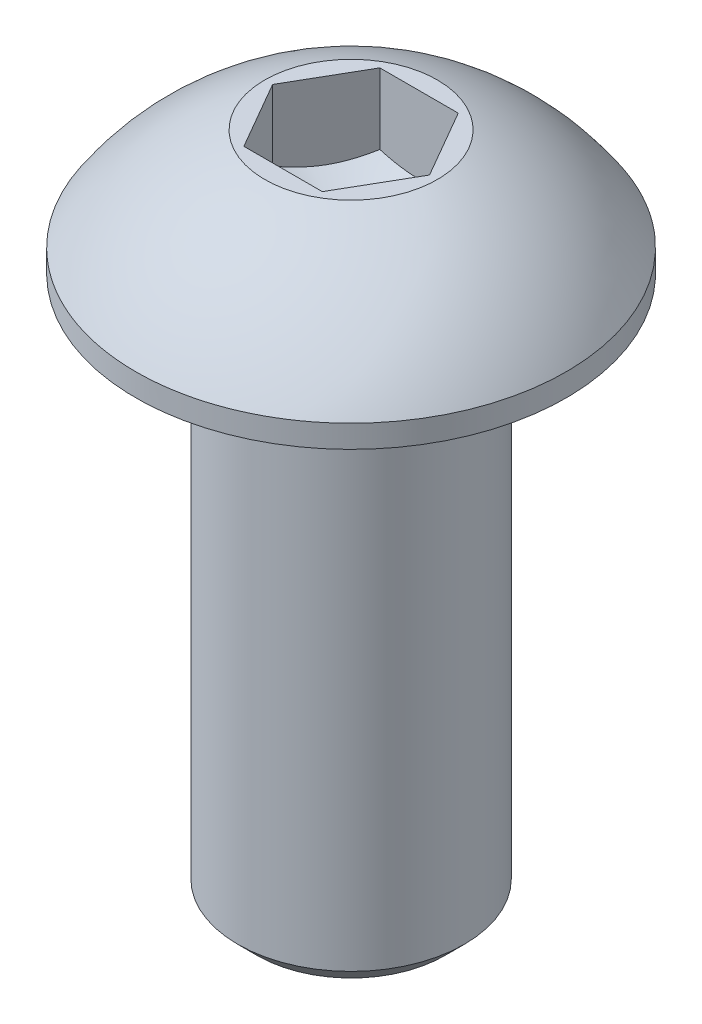
ISO-10303-21;
HEADER;
FILE_DESCRIPTION(('STEP AP214'),'2;1');
FILE_NAME('part.step','',(''),(''),'','','');
FILE_SCHEMA(('AUTOMOTIVE_DESIGN { 1 0 10303 214 1 1 1 1 }'));
ENDSEC;
DATA;
#1=APPLICATION_CONTEXT('core data for automotive mechanical design processes');
#2=APPLICATION_PROTOCOL_DEFINITION('international standard','automotive_design',2000,#1);
#3=PRODUCT_CONTEXT('',#1,'mechanical');
#4=PRODUCT('Part','Part','',(#3));
#5=PRODUCT_RELATED_PRODUCT_CATEGORY('part','',(#4));
#6=PRODUCT_DEFINITION_FORMATION('','',#4);
#7=PRODUCT_DEFINITION_CONTEXT('part definition',#1,'design');
#8=PRODUCT_DEFINITION('design','',#6,#7);
#9=PRODUCT_DEFINITION_SHAPE('','',#8);
#10=(LENGTH_UNIT() NAMED_UNIT(*) SI_UNIT(.MILLI.,.METRE.));
#11=(NAMED_UNIT(*) PLANE_ANGLE_UNIT() SI_UNIT($,.RADIAN.));
#12=(NAMED_UNIT(*) SI_UNIT($,.STERADIAN.) SOLID_ANGLE_UNIT());
#13=UNCERTAINTY_MEASURE_WITH_UNIT(LENGTH_MEASURE(1.E-05),#10,'distance_accuracy_value','');
#14=(GEOMETRIC_REPRESENTATION_CONTEXT(3) GLOBAL_UNCERTAINTY_ASSIGNED_CONTEXT((#13)) GLOBAL_UNIT_ASSIGNED_CONTEXT((#10,
#11,#12)) REPRESENTATION_CONTEXT('',''));
#15=CARTESIAN_POINT('',(0.,0.,0.));
#16=DIRECTION('',(0.,0.,1.));
#17=DIRECTION('',(1.,0.,0.));
#18=AXIS2_PLACEMENT_3D('',#15,#16,#17);
#19=CARTESIAN_POINT('',(25.2875699581005,61.0625140259606,-18.4338280446872));
#20=DIRECTION('',(-0.866156744758905,0.,0.499772441725888));
#21=DIRECTION('',(0.499772441725888,0.,0.866156744758905));
#22=AXIS2_PLACEMENT_3D('',#19,#20,#21);
#23=PLANE('',#22);
#24=CARTESIAN_POINT('',(24.4079989055874,62.1904554538318,-19.9582153160852));
#25=CARTESIAN_POINT('',(24.4460292876593,62.1684624393874,-19.8923043275488));
#26=CARTESIAN_POINT('',(24.4843880318555,62.1484570513897,-19.8258245179037));
#27=CARTESIAN_POINT('',(24.5617704570964,62.1135294060621,-19.6917127277197));
#28=CARTESIAN_POINT('',(24.6007955177377,62.0986195140854,-19.6240783567605));
#29=CARTESIAN_POINT('',(24.67836228217,62.0753989685825,-19.4896472578103));
#30=CARTESIAN_POINT('',(24.7168920261015,62.0669340457353,-19.4228712590299));
#31=CARTESIAN_POINT('',(24.7941338107735,62.0568098745484,-19.2890033387142));
#32=CARTESIAN_POINT('',(24.832845568946,62.0551422667816,-19.221911906878));
#33=CARTESIAN_POINT('',(24.905176901676,62.0585212235206,-19.0965543133322));
#34=CARTESIAN_POINT('',(24.9388071951602,62.0627268894843,-19.0382695751857));
#35=CARTESIAN_POINT('',(25.005849245782,62.0760806101283,-18.9220788456595));
#36=CARTESIAN_POINT('',(25.0392607714229,62.0852332430356,-18.8641732554882));
#37=CARTESIAN_POINT('',(25.1064420674421,62.1081249634696,-18.7477412001548));
#38=CARTESIAN_POINT('',(25.1402033386075,62.1219613063973,-18.6892294649925));
#39=CARTESIAN_POINT('',(25.2072223946131,62.1533709961848,-18.5730785879527));
#40=CARTESIAN_POINT('',(25.240481037805,62.1709369529404,-18.5154379584641));
#41=CARTESIAN_POINT('',(25.2735009599612,62.190000726653,-18.4582110570603));
#42=B_SPLINE_CURVE_WITH_KNOTS('',3,(#24,#25,#26,#27,#28,#29,#30,#31,#32,#33,#34,#35,#36,#37,#38,
#39,#40,#41),.UNSPECIFIED.,.F.,.F.,(4,2,2,2,2,2,2,2,4),(0.,0.237724267372568,0.476021395837421,
0.70841776698037,0.940528247635078,1.14260334855099,1.34486578318952,1.55161587420285,
1.75796005758239),.UNSPECIFIED.);
#43=CARTESIAN_POINT('',(24.4080009590961,62.1904554104541,-19.9582132383015));
#44=VERTEX_POINT('',#43);
#45=CARTESIAN_POINT('',(25.2735003112266,62.1900003521055,-18.4582121813837));
#46=VERTEX_POINT('',#45);
#47=EDGE_CURVE('E21',#44,#46,#42,.T.);
#48=ORIENTED_EDGE('',*,*,#47,.T.);
#49=DIRECTION('',(0.,1.,0.));
#50=VECTOR('',#49,1.);
#51=CARTESIAN_POINT('',(25.273499701385,61.0625140259606,-18.4582132383015));
#52=LINE('',#51,#50);
#53=CARTESIAN_POINT('',(25.273499701385,63.7500000000003,-18.4582132383015));
#54=VERTEX_POINT('',#53);
#55=EDGE_CURVE('E117',#54,#46,#52,.F.);
#56=ORIENTED_EDGE('',*,*,#55,.F.);
#57=DIRECTION('',(0.499772441725888,0.,0.866156744758905));
#58=VECTOR('',#57,1.);
#59=CARTESIAN_POINT('',(25.2875699581005,63.7500000000003,-18.4338280446872));
#60=LINE('',#59,#58);
#61=CARTESIAN_POINT('',(24.4080002252739,63.7500000000003,-19.9582132383015));
#62=VERTEX_POINT('',#61);
#63=EDGE_CURVE('E90',#54,#62,#60,.F.);
#64=ORIENTED_EDGE('',*,*,#63,.T.);
#65=DIRECTION('',(0.,1.,0.));
#66=VECTOR('',#65,1.);
#67=CARTESIAN_POINT('',(24.407999701385,61.0625140259606,-19.9582132383015));
#68=LINE('',#67,#66);
#69=EDGE_CURVE('E82',#62,#44,#68,.F.);
#70=ORIENTED_EDGE('',*,*,#69,.T.);
#71=EDGE_LOOP('',(#48,#56,#64,#70));
#72=FACE_BOUND('',#71,.T.);
#73=ADVANCED_FACE('F17',(#72),#23,.T.);
#74=CARTESIAN_POINT('',(24.3939294446696,61.0625140259606,-16.9338280446872));
#75=DIRECTION('',(-0.866156744758905,0.,-0.499772441725888));
#76=DIRECTION('',(-0.499772441725888,0.,0.866156744758905));
#77=AXIS2_PLACEMENT_3D('',#74,#75,#76);
#78=PLANE('',#77);
#79=CARTESIAN_POINT('',(25.2735015095974,62.1900006982656,-18.4582157730405));
#80=CARTESIAN_POINT('',(25.235483544399,62.1680447159464,-18.3923271358156));
#81=CARTESIAN_POINT('',(25.1971375066611,62.1480787424786,-18.3258696889119));
#82=CARTESIAN_POINT('',(25.1197819129971,62.1132330548837,-18.1918046507205));
#83=CARTESIAN_POINT('',(25.0807709854409,62.0983656634289,-18.1241946817774));
#84=CARTESIAN_POINT('',(25.0032329644461,62.0752296986218,-17.9898133326686));
#85=CARTESIAN_POINT('',(24.9647177875064,62.0668069329505,-17.9230626036842));
#86=CARTESIAN_POINT('',(24.8875068721702,62.0567640464519,-17.7892482003083));
#87=CARTESIAN_POINT('',(24.8488114132894,62.0551355919272,-17.7221850103631));
#88=CARTESIAN_POINT('',(24.7764807244684,62.0585827085958,-17.5968285287383));
#89=CARTESIAN_POINT('',(24.7428346512771,62.0628231270521,-17.5385164441194));
#90=CARTESIAN_POINT('',(24.6757623104552,62.0762481138399,-17.4222732195933));
#91=CARTESIAN_POINT('',(24.642336275836,62.0854372676777,-17.3643424835181));
#92=CARTESIAN_POINT('',(24.5751262561784,62.1084023640229,-17.2478606468864));
#93=CARTESIAN_POINT('',(24.5413507970164,62.122275599591,-17.1893243225501));
#94=CARTESIAN_POINT('',(24.4743041750231,62.1537572046101,-17.0731256709843));
#95=CARTESIAN_POINT('',(24.4410321505321,62.1713581694054,-17.0154618504103));
#96=CARTESIAN_POINT('',(24.4079989462962,62.1904554840955,-16.9582119296553));
#97=B_SPLINE_CURVE_WITH_KNOTS('',3,(#79,#80,#81,#82,#83,#84,#85,#86,#87,#88,#89,#90,#91,#92,#93,
#94,#95,#96),.UNSPECIFIED.,.F.,.F.,(4,2,2,2,2,2,2,2,4),(0.,0.23761959764792,0.475809511947106,
0.70810508806331,0.940115653507474,1.14229164082546,1.34465528788003,1.55151117229618,
1.75795995446192),.UNSPECIFIED.);
#98=CARTESIAN_POINT('',(24.4079988997876,62.1904555109839,-16.9582118490512));
#99=VERTEX_POINT('',#98);
#100=EDGE_CURVE('E96',#46,#99,#97,.T.);
#101=ORIENTED_EDGE('',*,*,#100,.T.);
#102=DIRECTION('',(0.,1.,0.));
#103=VECTOR('',#102,1.);
#104=CARTESIAN_POINT('',(24.4079988263394,61.0625140259606,-16.958211721758));
#105=LINE('',#104,#103);
#106=CARTESIAN_POINT('',(24.4079992638622,63.7500000000003,-16.9582124800297));
#107=VERTEX_POINT('',#106);
#108=EDGE_CURVE('E114',#99,#107,#105,.T.);
#109=ORIENTED_EDGE('',*,*,#108,.T.);
#110=DIRECTION('',(-0.499772441725888,0.,0.866156744758905));
#111=VECTOR('',#110,1.);
#112=CARTESIAN_POINT('',(24.3939294446696,63.7500000000003,-16.9338280446872));
#113=LINE('',#112,#111);
#114=EDGE_CURVE('E91',#107,#54,#113,.F.);
#115=ORIENTED_EDGE('',*,*,#114,.T.);
#116=ORIENTED_EDGE('',*,*,#55,.T.);
#117=EDGE_LOOP('',(#101,#109,#115,#116));
#118=FACE_BOUND('',#117,.T.);
#119=ADVANCED_FACE('F207',(#118),#78,.T.);
#120=CARTESIAN_POINT('',(21.7974294446695,61.0625140259606,-18.4825984319158));
#121=DIRECTION('',(0.866156744758905,0.,-0.499772441725888));
#122=DIRECTION('',(-0.499772441725888,0.,-0.866156744758905));
#123=AXIS2_PLACEMENT_3D('',#120,#121,#122);
#124=PLANE('',#123);
#125=CARTESIAN_POINT('',(22.677000235253,62.1904553032168,-16.9582116248233));
#126=CARTESIAN_POINT('',(22.6389698548026,62.1684622992195,-17.0241226039139));
#127=CARTESIAN_POINT('',(22.6006111137923,62.1484569236713,-17.0906024053152));
#128=CARTESIAN_POINT('',(22.5232286967178,62.1135293053849,-17.22471417935));
#129=CARTESIAN_POINT('',(22.4842036410632,62.0986194279848,-17.2923485424013));
#130=CARTESIAN_POINT('',(22.4066368863105,62.0753989112017,-17.4267796250984));
#131=CARTESIAN_POINT('',(22.3681071470646,62.0669340025458,-17.4935556155689));
#132=CARTESIAN_POINT('',(22.2908653724247,62.0568098588601,-17.6274235183605));
#133=CARTESIAN_POINT('',(22.2521536195975,62.055142264414,-17.6945149409843));
#134=CARTESIAN_POINT('',(22.1798223021718,62.0585212436484,-17.8198725080382));
#135=CARTESIAN_POINT('',(22.1461920185744,62.0627269183172,-17.8781572290391));
#136=CARTESIAN_POINT('',(22.0791499879139,62.0760806526748,-17.9943479239621));
#137=CARTESIAN_POINT('',(22.0457384723475,62.0852332905823,-18.0522534966761));
#138=CARTESIAN_POINT('',(21.9785571969066,62.1081250174652,-18.1686855163476));
#139=CARTESIAN_POINT('',(21.9447959362393,62.1219613617224,-18.2271972333151));
#140=CARTESIAN_POINT('',(21.8777769009423,62.153371051093,-18.3433480744635));
#141=CARTESIAN_POINT('',(21.8445182679619,62.1709370061128,-18.400988686254));
#142=CARTESIAN_POINT('',(21.8114983558446,62.1900007768814,-18.4582155702605));
#143=B_SPLINE_CURVE_WITH_KNOTS('',3,(#125,#126,#127,#128,#129,#130,#131,#132,#133,#134,#135,
#136,#137,#138,#139,#140,#141,#142),.UNSPECIFIED.,.F.,.F.,(4,2,2,2,2,2,2,2,4),(0.,
0.237724232525688,0.476021325137557,0.708417663198815,0.940528111144143,1.14260315465067,
1.34486553162718,1.55161556186056,1.75795968482533),.UNSPECIFIED.);
#144=CARTESIAN_POINT('',(22.6770001022706,62.1904552793362,-16.9582125435256));
#145=VERTEX_POINT('',#144);
#146=CARTESIAN_POINT('',(21.8114983193965,62.1900007979248,-18.4582156334287));
#147=VERTEX_POINT('',#146);
#148=EDGE_CURVE('E87',#145,#147,#143,.T.);
#149=ORIENTED_EDGE('',*,*,#148,.T.);
#150=DIRECTION('',(0.,1.,0.));
#151=VECTOR('',#150,1.);
#152=CARTESIAN_POINT('',(21.8114982728377,61.0625140259606,-18.4582157141199));
#153=LINE('',#152,#151);
#154=CARTESIAN_POINT('',(21.8114989871114,63.7500000000003,-18.4582144762107));
#155=VERTEX_POINT('',#154);
#156=EDGE_CURVE('E97',#147,#155,#153,.T.);
#157=ORIENTED_EDGE('',*,*,#156,.T.);
#158=DIRECTION('',(-0.499772441725888,0.,-0.866156744758905));
#159=VECTOR('',#158,1.);
#160=CARTESIAN_POINT('',(21.7974294446695,63.7500000000003,-18.4825984319158));
#161=LINE('',#160,#159);
#162=CARTESIAN_POINT('',(22.6769996577673,63.7500000000003,-16.9582132383015));
#163=VERTEX_POINT('',#162);
#164=EDGE_CURVE('E104',#155,#163,#161,.F.);
#165=ORIENTED_EDGE('',*,*,#164,.T.);
#166=DIRECTION('',(0.,1.,0.));
#167=VECTOR('',#166,1.);
#168=CARTESIAN_POINT('',(22.676999701385,61.0625140259606,-16.9582132383015));
#169=LINE('',#168,#167);
#170=EDGE_CURVE('E99',#163,#145,#169,.F.);
#171=ORIENTED_EDGE('',*,*,#170,.T.);
#172=EDGE_LOOP('',(#149,#157,#165,#171));
#173=FACE_BOUND('',#172,.T.);
#174=ADVANCED_FACE('F195',(#173),#124,.T.);
#175=CARTESIAN_POINT('',(23.542499701385,62.1964573418268,-18.4582132383015));
#176=DIRECTION('',(0.,1.,0.));
#177=DIRECTION('',(-1.,0.,0.));
#178=AXIS2_PLACEMENT_3D('',#175,#176,#177);
#179=CONICAL_SURFACE('',#178,1.74218444406633,1.04719755106752);
#180=CARTESIAN_POINT('',(23.542499701385,61.1906066839651,-18.458213238489));
#181=VERTEX_POINT('',#180);
#182=VERTEX_LOOP('',#181);
#183=FACE_BOUND('',#182,.T.);
#184=CARTESIAN_POINT('',(21.8114983403319,62.1900004682245,-18.4582114298294));
#185=CARTESIAN_POINT('',(21.8495162844891,62.168044496035,-18.5241000618006));
#186=CARTESIAN_POINT('',(21.8878623098461,62.1480785396424,-18.5905575000513));
#187=CARTESIAN_POINT('',(21.9652178856658,62.1132328930303,-18.724622516705));
#188=CARTESIAN_POINT('',(22.0042288077719,62.0983655254598,-18.7922324727469));
#189=CARTESIAN_POINT('',(22.081766815594,62.075229606989,-18.9266137965686));
#190=CARTESIAN_POINT('',(22.1202819848875,62.0668068638586,-18.9933645131913));
#191=CARTESIAN_POINT('',(22.1974928845842,62.0567640213947,-19.1271788901088));
#192=CARTESIAN_POINT('',(22.2361883354729,62.0551355883847,-19.1942420659607));
#193=CARTESIAN_POINT('',(22.3085189952095,62.0585827412323,-19.3195984970276));
#194=CARTESIAN_POINT('',(22.3421650474606,62.062823172739,-19.3779105454066));
#195=CARTESIAN_POINT('',(22.4092373462085,62.0762481782677,-19.4941536970524));
#196=CARTESIAN_POINT('',(22.4426633596946,62.0854373377773,-19.5520843964881));
#197=CARTESIAN_POINT('',(22.5098733363233,62.1084024385501,-19.6685661585352));
#198=CARTESIAN_POINT('',(22.5436487736026,62.1222756726446,-19.7271024449495));
#199=CARTESIAN_POINT('',(22.610695352494,62.1537572689739,-19.8433010218209));
#200=CARTESIAN_POINT('',(22.6439673557632,62.1713582265769,-19.9009648056182));
#201=CARTESIAN_POINT('',(22.6770005391278,62.1904555319004,-19.9582146901954));
#202=B_SPLINE_CURVE_WITH_KNOTS('',3,(#184,#185,#186,#187,#188,#189,#190,#191,#192,#193,#194,
#195,#196,#197,#198,#199,#200,#201),.UNSPECIFIED.,.F.,.F.,(4,2,2,2,2,2,2,2,4),(0.,
0.237619544874589,0.475809404466599,0.708104930000151,0.940115445596371,1.14229131051838,
1.34465483458178,1.55151058973374,1.75795924357602),.UNSPECIFIED.);
#203=CARTESIAN_POINT('',(22.6769989003149,62.1904556271558,-19.9582139350819));
#204=VERTEX_POINT('',#203);
#205=EDGE_CURVE('E160',#147,#204,#202,.T.);
#206=ORIENTED_EDGE('',*,*,#205,.F.);
#207=ORIENTED_EDGE('',*,*,#148,.F.);
#208=CARTESIAN_POINT('',(24.4080021898122,62.1904557546,-16.958213221544));
#209=CARTESIAN_POINT('',(24.33695222647,62.1699524929934,-16.958213232283));
#210=CARTESIAN_POINT('',(24.265340518636,62.1511819648535,-16.9582132366885));
#211=CARTESIAN_POINT('',(24.120954930079,62.1180083974505,-16.9582132399181));
#212=CARTESIAN_POINT('',(24.048178829209,62.1036151099298,-16.9582132387299));
#213=CARTESIAN_POINT('',(23.903442410012,62.0804691482227,-16.958213237883));
#214=CARTESIAN_POINT('',(23.8315024276688,62.0715931820989,-16.9582132381894));
#215=CARTESIAN_POINT('',(23.6872078409772,62.0596778130306,-16.9582132384135));
#216=CARTESIAN_POINT('',(23.614853771187,62.0566320878266,-16.9582132383315));
#217=CARTESIAN_POINT('',(23.470145623733,62.0566320877931,-16.9582132382715));
#218=CARTESIAN_POINT('',(23.3977915460694,62.0596778136244,-16.9582132382934));
#219=CARTESIAN_POINT('',(23.2534969438402,62.0715931853865,-16.9582132383096));
#220=CARTESIAN_POINT('',(23.1815569538332,62.0804691535793,-16.9582132383038));
#221=CARTESIAN_POINT('',(23.0368205189319,62.1036151195569,-16.9582132382991));
#222=CARTESIAN_POINT('',(22.9640444100241,62.1180084092955,-16.9582132383003));
#223=CARTESIAN_POINT('',(22.8196588065376,62.1511819852319,-16.9582132383027));
#224=CARTESIAN_POINT('',(22.7480470918094,62.1699525196786,-16.9582132383039));
#225=CARTESIAN_POINT('',(22.6769971226948,62.1904557916343,-16.9582132383015));
#226=B_SPLINE_CURVE_WITH_KNOTS('',3,(#208,#209,#210,#211,#212,#213,#214,#215,#216,#217,#218,
#219,#220,#221,#222,#223,#224,#225),.UNSPECIFIED.,.F.,.F.,(4,2,2,2,2,2,2,2,4),(0.,
0.221915605038876,0.444322038225478,0.661560736166959,0.878563728720791,1.09556674481817,
1.31280546635714,1.5352119243224,1.7571275541036),.UNSPECIFIED.);
#227=EDGE_CURVE('E86',#99,#145,#226,.T.);
#228=ORIENTED_EDGE('',*,*,#227,.F.);
#229=ORIENTED_EDGE('',*,*,#100,.F.);
#230=ORIENTED_EDGE('',*,*,#47,.F.);
#231=CARTESIAN_POINT('',(22.6769972648925,62.1904556369687,-19.9582134118898));
#232=CARTESIAN_POINT('',(22.7480472367591,62.1699524400402,-19.9582133006466));
#233=CARTESIAN_POINT('',(22.819658943617,62.1511819402819,-19.9582132550108));
#234=CARTESIAN_POINT('',(22.9640445226051,62.1180083969101,-19.9582132215552));
#235=CARTESIAN_POINT('',(23.0368206148759,62.1036151050222,-19.9582132338635));
#236=CARTESIAN_POINT('',(23.181557020572,62.0804691421134,-19.9582132426364));
#237=CARTESIAN_POINT('',(23.2534969979844,62.071593179083,-19.9582132394625));
#238=CARTESIAN_POINT('',(23.3977915737359,62.0596778131687,-19.9582132371418));
#239=CARTESIAN_POINT('',(23.4701456375151,62.0566320879967,-19.9582132379906));
#240=CARTESIAN_POINT('',(23.6148537775517,62.056632087623,-19.9582132386124));
#241=CARTESIAN_POINT('',(23.6872078538091,62.0596778134565,-19.9582132383853));
#242=CARTESIAN_POINT('',(23.8315024535002,62.0715931848671,-19.9582132382176));
#243=CARTESIAN_POINT('',(23.9034424423736,62.080469152729,-19.9582132382773));
#244=CARTESIAN_POINT('',(24.0481788737195,62.1036151177344,-19.9582132383263));
#245=CARTESIAN_POINT('',(24.1209549802226,62.1180084067336,-19.9582132383139));
#246=CARTESIAN_POINT('',(24.2653405785587,62.1511819808559,-19.9582132382891));
#247=CARTESIAN_POINT('',(24.3369522905468,62.1699525142029,-19.9582132382768));
#248=CARTESIAN_POINT('',(24.4080022569617,62.1904557849455,-19.9582132383015));
#249=B_SPLINE_CURVE_WITH_KNOTS('',3,(#231,#232,#233,#234,#235,#236,#237,#238,#239,#240,#241,
#242,#243,#244,#245,#246,#247,#248),.UNSPECIFIED.,.F.,.F.,(4,2,2,2,2,2,2,2,4),(0.,
0.221915580818825,0.444321992510872,0.66156067396719,0.878563648868686,1.09556666065075,
1.31280537873944,1.53521182920032,1.75712745020166),.UNSPECIFIED.);
#250=EDGE_CURVE('E80',#204,#44,#249,.T.);
#251=ORIENTED_EDGE('',*,*,#250,.F.);
#252=EDGE_LOOP('',(#206,#207,#228,#229,#230,#251));
#253=FACE_BOUND('',#252,.T.);
#254=ADVANCED_FACE('F94',(#183,#253),#179,.F.);
#255=CARTESIAN_POINT('',(22.6488463749094,61.0625140259606,-16.9582132383015));
#256=DIRECTION('',(0.,0.,-1.));
#257=DIRECTION('',(-1.,0.,0.));
#258=AXIS2_PLACEMENT_3D('',#255,#256,#257);
#259=PLANE('',#258);
#260=ORIENTED_EDGE('',*,*,#227,.T.);
#261=ORIENTED_EDGE('',*,*,#170,.F.);
#262=DIRECTION('',(1.,0.,0.));
#263=VECTOR('',#262,1.);
#264=CARTESIAN_POINT('',(21.600317701385,63.7500000000003,-16.9582132383015));
#265=LINE('',#264,#263);
#266=EDGE_CURVE('E128',#107,#163,#265,.F.);
#267=ORIENTED_EDGE('',*,*,#266,.F.);
#268=ORIENTED_EDGE('',*,*,#108,.F.);
#269=EDGE_LOOP('',(#260,#261,#267,#268));
#270=FACE_BOUND('',#269,.T.);
#271=ADVANCED_FACE('F194',(#270),#259,.T.);
#272=CARTESIAN_POINT('',(22.6910699581005,61.0625140259606,-19.9825984319158));
#273=DIRECTION('',(0.866156744758905,0.,0.499772441725888));
#274=DIRECTION('',(0.499772441725888,0.,-0.866156744758905));
#275=AXIS2_PLACEMENT_3D('',#272,#273,#274);
#276=PLANE('',#275);
#277=ORIENTED_EDGE('',*,*,#205,.T.);
#278=DIRECTION('',(0.,1.,0.));
#279=VECTOR('',#278,1.);
#280=CARTESIAN_POINT('',(22.676999701385,61.0625140259606,-19.9582132383015));
#281=LINE('',#280,#279);
#282=CARTESIAN_POINT('',(22.676999701385,63.7500000000003,-19.9582132383015));
#283=VERTEX_POINT('',#282);
#284=EDGE_CURVE('E40',#283,#204,#281,.F.);
#285=ORIENTED_EDGE('',*,*,#284,.F.);
#286=DIRECTION('',(0.49977244172589,0.,-0.866156744758905));
#287=VECTOR('',#286,1.);
#288=CARTESIAN_POINT('',(21.811499701385,63.7500000000003,-18.4582132383015));
#289=LINE('',#288,#287);
#290=EDGE_CURVE('E131',#155,#283,#289,.T.);
#291=ORIENTED_EDGE('',*,*,#290,.F.);
#292=ORIENTED_EDGE('',*,*,#156,.F.);
#293=EDGE_LOOP('',(#277,#285,#291,#292));
#294=FACE_BOUND('',#293,.T.);
#295=ADVANCED_FACE('F178',(#294),#276,.T.);
#296=CARTESIAN_POINT('',(24.4361530278607,61.0625140259606,-19.9582132383015));
#297=DIRECTION('',(0.,0.,1.));
#298=DIRECTION('',(1.,0.,0.));
#299=AXIS2_PLACEMENT_3D('',#296,#297,#298);
#300=PLANE('',#299);
#301=ORIENTED_EDGE('',*,*,#250,.T.);
#302=ORIENTED_EDGE('',*,*,#69,.F.);
#303=DIRECTION('',(1.,0.,0.));
#304=VECTOR('',#303,1.);
#305=CARTESIAN_POINT('',(21.600317701385,63.7500000000003,-19.9582132383015));
#306=LINE('',#305,#304);
#307=EDGE_CURVE('E159',#283,#62,#306,.T.);
#308=ORIENTED_EDGE('',*,*,#307,.F.);
#309=ORIENTED_EDGE('',*,*,#284,.T.);
#310=EDGE_LOOP('',(#301,#302,#308,#309));
#311=FACE_BOUND('',#310,.T.);
#312=ADVANCED_FACE('F81',(#311),#300,.T.);
#313=CARTESIAN_POINT('',(21.600317701385,63.7500000000003,-16.5160312383015));
#314=DIRECTION('',(0.,1.,0.));
#315=DIRECTION('',(0.,0.,1.));
#316=AXIS2_PLACEMENT_3D('',#313,#314,#315);
#317=PLANE('',#316);
#318=CARTESIAN_POINT('',(23.542499701385,63.7500000000003,-20.3623132383012));
#319=CARTESIAN_POINT('',(23.5959608582823,63.7500000000003,-20.3623129177123));
#320=CARTESIAN_POINT('',(23.6494318404996,63.7500000000003,-20.3600596917456));
#321=CARTESIAN_POINT('',(23.7560042852378,63.7500000000003,-20.3510614428682));
#322=CARTESIAN_POINT('',(23.8091056339867,63.7500000000003,-20.3443150938384));
#323=CARTESIAN_POINT('',(23.9146406384175,63.7500000000003,-20.3263609320657));
#324=CARTESIAN_POINT('',(23.9670730972058,63.7500000000004,-20.3151460372579));
#325=CARTESIAN_POINT('',(24.0708359846994,63.7500000000002,-20.2883321601209));
#326=CARTESIAN_POINT('',(24.1221654825628,63.7499999999998,-20.2727296200763));
#327=CARTESIAN_POINT('',(24.2737301626962,63.7499999999995,-20.2195558538105));
#328=CARTESIAN_POINT('',(24.3717966008252,63.7500000000003,-20.1755748071976));
#329=CARTESIAN_POINT('',(24.5591414744405,63.7500000000003,-20.0717520968449));
#330=CARTESIAN_POINT('',(24.6484195756808,63.7499999999996,-20.0119098301757));
#331=CARTESIAN_POINT('',(24.7738108864878,63.7499999999999,-19.9116047061598));
#332=CARTESIAN_POINT('',(24.8142106391548,63.7500000000002,-19.876386225778));
#333=CARTESIAN_POINT('',(24.8918646807181,63.7500000000004,-19.8027107483517));
#334=CARTESIAN_POINT('',(24.9291219647602,63.7500000000003,-19.7642569064637));
#335=CARTESIAN_POINT('',(25.03585415783,63.7500000000002,-19.6443497536104));
#336=CARTESIAN_POINT('',(25.100316530446,63.7500000000003,-19.5583290755642));
#337=CARTESIAN_POINT('',(25.2138464278555,63.7500000000003,-19.3767330715991));
#338=CARTESIAN_POINT('',(25.2629145331434,63.7500000000003,-19.2811581061372));
#339=CARTESIAN_POINT('',(25.3443176381033,63.7500000000003,-19.0831162785037));
#340=CARTESIAN_POINT('',(25.3766528164908,63.7500000000003,-18.9806494899531));
#341=CARTESIAN_POINT('',(25.4236589994484,63.7500000000003,-18.7717440389735));
#342=CARTESIAN_POINT('',(25.4383299096839,63.7500000000003,-18.665305355336));
#343=CARTESIAN_POINT('',(25.4495953802942,63.7500000000003,-18.4514756480393));
#344=CARTESIAN_POINT('',(25.4461899406689,63.7500000000003,-18.34408462438));
#345=CARTESIAN_POINT('',(25.4213951302981,63.7500000000003,-18.1313963876016));
#346=CARTESIAN_POINT('',(25.4000058555935,63.7500000000003,-18.0260991633037));
#347=CARTESIAN_POINT('',(25.3398630248279,63.7500000000003,-17.8206000856974));
#348=CARTESIAN_POINT('',(25.3011092833048,63.7500000000003,-17.7203982868235));
#349=CARTESIAN_POINT('',(25.2072894338036,63.7500000000003,-17.5278782044909));
#350=CARTESIAN_POINT('',(25.1522227106687,63.7500000000003,-17.4355602184971));
#351=CARTESIAN_POINT('',(25.0586808568113,63.7500000000003,-17.3051017656481));
#352=CARTESIAN_POINT('',(25.0256704386327,63.7500000000003,-17.2629459183454));
#353=CARTESIAN_POINT('',(24.9561878781973,63.7500000000003,-17.1815186505512));
#354=CARTESIAN_POINT('',(24.9197124258414,63.7500000000003,-17.1422500530287));
#355=CARTESIAN_POINT('',(24.8055550277003,63.7500000000003,-17.0293244705442));
#356=CARTESIAN_POINT('',(24.7230592055084,63.7500000000003,-16.9604324132222));
#357=CARTESIAN_POINT('',(24.5476608310418,63.7500000000003,-16.8374988250969));
#358=CARTESIAN_POINT('',(24.454758674517,63.7500000000003,-16.7834567298237));
#359=CARTESIAN_POINT('',(24.3096203803818,63.7500000000003,-16.7146513720495));
#360=CARTESIAN_POINT('',(24.260214505416,63.7500000000003,-16.6937416583827));
#361=CARTESIAN_POINT('',(24.159843560482,63.7500000000003,-16.6561731311131));
#362=CARTESIAN_POINT('',(24.1088797900365,63.7500000000003,-16.6395108773003));
#363=CARTESIAN_POINT('',(24.0058155864411,63.7500000000003,-16.6105668101631));
#364=CARTESIAN_POINT('',(23.9537170877208,63.7500000000003,-16.5982780797455));
#365=CARTESIAN_POINT('',(23.8486801268479,63.7500000000003,-16.5781313353204));
#366=CARTESIAN_POINT('',(23.795741917182,63.7500000000003,-16.5702720144899));
#367=CARTESIAN_POINT('',(23.7093513318134,63.7500000000003,-16.5611432973225));
#368=CARTESIAN_POINT('',(23.6760372733572,63.7500000000003,-16.5585078595404));
#369=CARTESIAN_POINT('',(23.6093166561844,63.7500000000003,-16.5549927298545));
#370=CARTESIAN_POINT('',(23.5759100974678,63.7500000000003,-16.5541130379507));
#371=CARTESIAN_POINT('',(23.4890385444877,63.7500000000003,-16.5541135588908));
#372=CARTESIAN_POINT('',(23.4355675622704,63.7500000000003,-16.5563667848574));
#373=CARTESIAN_POINT('',(23.3289951175322,63.7500000000003,-16.5653650337347));
#374=CARTESIAN_POINT('',(23.2758937687833,63.7500000000003,-16.5721113827646));
#375=CARTESIAN_POINT('',(23.1703587643525,63.7500000000003,-16.5900655445373));
#376=CARTESIAN_POINT('',(23.1179263055642,63.7500000000004,-16.6012804393451));
#377=CARTESIAN_POINT('',(23.0141634180706,63.7500000000002,-16.6280943164821));
#378=CARTESIAN_POINT('',(22.9628339202072,63.7499999999998,-16.6436968565267));
#379=CARTESIAN_POINT('',(22.8112692400738,63.7499999999995,-16.6968706227925));
#380=CARTESIAN_POINT('',(22.7132028019448,63.7500000000003,-16.7408516694054));
#381=CARTESIAN_POINT('',(22.5258579283295,63.7500000000003,-16.8446743797581));
#382=CARTESIAN_POINT('',(22.4365798270893,63.7499999999996,-16.9045166464273));
#383=CARTESIAN_POINT('',(22.3111885162822,63.7499999999999,-17.0048217704432));
#384=CARTESIAN_POINT('',(22.2707887636152,63.7500000000002,-17.040040250825));
#385=CARTESIAN_POINT('',(22.1931347220519,63.7500000000004,-17.1137157282513));
#386=CARTESIAN_POINT('',(22.1558774380098,63.7500000000003,-17.1521695701393));
#387=CARTESIAN_POINT('',(22.04914524494,63.7500000000002,-17.2720767229926));
#388=CARTESIAN_POINT('',(21.984682872324,63.7500000000003,-17.3580974010388));
#389=CARTESIAN_POINT('',(21.8711529749145,63.7500000000003,-17.5396934050039));
#390=CARTESIAN_POINT('',(21.8220848696266,63.7500000000003,-17.6352683704658));
#391=CARTESIAN_POINT('',(21.7406817646667,63.7500000000003,-17.8333101980993));
#392=CARTESIAN_POINT('',(21.7083465862792,63.7500000000003,-17.9357769866499));
#393=CARTESIAN_POINT('',(21.6613404033216,63.7500000000003,-18.1446824376295));
#394=CARTESIAN_POINT('',(21.6466694930861,63.7500000000003,-18.251121121267));
#395=CARTESIAN_POINT('',(21.6354040224759,63.7500000000003,-18.4649508285637));
#396=CARTESIAN_POINT('',(21.6388094621011,63.7500000000003,-18.572341852223));
#397=CARTESIAN_POINT('',(21.6636042724719,63.7500000000003,-18.7850300890014));
#398=CARTESIAN_POINT('',(21.6849935471765,63.7500000000003,-18.8903273132993));
#399=CARTESIAN_POINT('',(21.7451363779421,63.7500000000003,-19.0958263909056));
#400=CARTESIAN_POINT('',(21.7838901194651,63.7500000000003,-19.1960281897795));
#401=CARTESIAN_POINT('',(21.8777099689664,63.7500000000003,-19.3885482721121));
#402=CARTESIAN_POINT('',(21.9327766921013,63.7500000000003,-19.4808662581059));
#403=CARTESIAN_POINT('',(22.0263185459588,63.7500000000003,-19.6113247109549));
#404=CARTESIAN_POINT('',(22.0593289641373,63.7500000000003,-19.6534805582576));
#405=CARTESIAN_POINT('',(22.1288115245726,63.7500000000003,-19.7349078260518));
#406=CARTESIAN_POINT('',(22.1652869769286,63.7500000000003,-19.7741764235743));
#407=CARTESIAN_POINT('',(22.2794443750697,63.7500000000003,-19.8871020060587));
#408=CARTESIAN_POINT('',(22.3619401972616,63.7500000000003,-19.9559940633808));
#409=CARTESIAN_POINT('',(22.5373385717282,63.7500000000003,-20.0789276515061));
#410=CARTESIAN_POINT('',(22.630240728253,63.7500000000003,-20.1329697467793));
#411=CARTESIAN_POINT('',(22.7753790223882,63.7500000000003,-20.2017751045534));
#412=CARTESIAN_POINT('',(22.824784897354,63.7500000000003,-20.2226848182203));
#413=CARTESIAN_POINT('',(22.925155842288,63.7500000000003,-20.2602533454899));
#414=CARTESIAN_POINT('',(22.9761196127335,63.7500000000003,-20.2769155993027));
#415=CARTESIAN_POINT('',(23.0791838163289,63.7500000000003,-20.3058596664399));
#416=CARTESIAN_POINT('',(23.1312823150492,63.7500000000003,-20.3181483968575));
#417=CARTESIAN_POINT('',(23.2363192759221,63.7500000000003,-20.3382951412826));
#418=CARTESIAN_POINT('',(23.289257485588,63.7500000000003,-20.3461544621131));
#419=CARTESIAN_POINT('',(23.3756480709566,63.7500000000003,-20.3552831792805));
#420=CARTESIAN_POINT('',(23.4089621294128,63.7500000000003,-20.3579186170626));
#421=CARTESIAN_POINT('',(23.4756827465856,63.7500000000003,-20.3614337467485));
#422=CARTESIAN_POINT('',(23.5090893053022,63.7500000000003,-20.3623134386523));
#423=CARTESIAN_POINT('',(23.542499701385,63.7500000000003,-20.3623132383012));
#424=B_SPLINE_CURVE_WITH_KNOTS('',3,(#318,#319,#320,#321,#322,#323,#324,#325,#326,#327,#328,
#329,#330,#331,#332,#333,#334,#335,#336,#337,#338,#339,#340,#341,#342,#343,#344,#345,#346,#347,
#348,#349,#350,#351,#352,#353,#354,#355,#356,#357,#358,#359,#360,#361,#362,#363,#364,#365,#366,
#367,#368,#369,#370,#371,#372,#373,#374,#375,#376,#377,#378,#379,#380,#381,#382,#383,#384,#385,
#386,#387,#388,#389,#390,#391,#392,#393,#394,#395,#396,#397,#398,#399,#400,#401,#402,#403,#404,
#405,#406,#407,#408,#409,#410,#411,#412,#413,#414,#415,#416,#417,#418,#419,#420,#421,#422,#423),
.UNSPECIFIED.,.T.,.F.,(4,2,2,2,2,2,2,2,2,2,2,2,2,2,2,2,2,2,2,2,2,2,2,2,2,2,2,2,2,2,2,2,2,2,2,2,
2,2,2,2,2,2,2,2,2,2,2,2,2,2,2,2,4),(0.,0.160352712781892,0.32075277372112,0.481408065586245,
0.642194002028475,0.962999427349795,1.28381704913281,1.44443605549253,1.60490020093843,
1.92572553703658,2.24653877384229,2.5673485841421,2.88816010769487,3.20897163124768,
3.52978144154754,3.85059467835321,4.17142001445094,4.33188415989666,4.49250316625623,
4.81332078803943,5.13412621336098,5.29491214980345,5.45556744166876,5.61596750260806,
5.77632021539007,5.87653218157124,5.97674414775242,6.13709686053431,6.29749692147353,
6.45815221333866,6.61893814978089,6.93974357510221,7.26056119688522,7.42118020324494,
7.58164434869085,7.90246968478899,8.2232829215947,8.54409273189452,8.86490425544729,
9.1857157790001,9.50652558929995,9.82733882610563,10.1481641622034,10.3086283076491,
10.4692473140086,10.7900649357919,11.1108703611134,11.2716562975559,11.4323115894212,
11.5927116503605,11.7530643631425,11.8532763293236,11.9534882955048),.UNSPECIFIED.);
#425=CARTESIAN_POINT('',(23.542499701385,63.7500000000003,-20.3623132383012));
#426=VERTEX_POINT('',#425);
#427=EDGE_CURVE('E152',#426,#426,#424,.T.);
#428=ORIENTED_EDGE('',*,*,#427,.F.);
#429=EDGE_LOOP('',(#428));
#430=FACE_BOUND('',#429,.T.);
#431=ORIENTED_EDGE('',*,*,#290,.T.);
#432=ORIENTED_EDGE('',*,*,#307,.T.);
#433=ORIENTED_EDGE('',*,*,#63,.F.);
#434=ORIENTED_EDGE('',*,*,#114,.F.);
#435=ORIENTED_EDGE('',*,*,#266,.T.);
#436=ORIENTED_EDGE('',*,*,#164,.F.);
#437=EDGE_LOOP('',(#431,#432,#433,#434,#435,#436));
#438=FACE_BOUND('',#437,.T.);
#439=ADVANCED_FACE('F171',(#430,#438),#317,.T.);
#440=CARTESIAN_POINT('',(23.542499701385,58.4167992911113,-18.4582132383015));
#441=DIRECTION('',(0.,0.,-1.));
#442=DIRECTION('',(1.,0.,0.));
#443=AXIS2_PLACEMENT_3D('',#440,#441,#442);
#444=SPHERICAL_SURFACE('',#443,5.66291679360495);
#445=ORIENTED_EDGE('',*,*,#427,.T.);
#446=EDGE_LOOP('',(#445));
#447=FACE_BOUND('',#446,.T.);
#448=CARTESIAN_POINT('',(23.542499701385,61.5000000000003,-18.4582132383015));
#449=DIRECTION('',(0.,-1.,0.));
#450=DIRECTION('',(0.,0.,-1.));
#451=AXIS2_PLACEMENT_3D('',#448,#449,#450);
#452=CIRCLE('',#451,4.75);
#453=CARTESIAN_POINT('',(23.542499701385,61.5000000000003,-23.2082132383015));
#454=VERTEX_POINT('',#453);
#455=EDGE_CURVE('E149',#454,#454,#452,.T.);
#456=ORIENTED_EDGE('',*,*,#455,.F.);
#457=EDGE_LOOP('',(#456));
#458=FACE_BOUND('',#457,.T.);
#459=ADVANCED_FACE('F167',(#447,#458),#444,.T.);
#460=CARTESIAN_POINT('',(23.542499701385,61.5000000000003,-18.4582132383015));
#461=DIRECTION('',(0.,-1.,0.));
#462=DIRECTION('',(0.,0.,-1.));
#463=AXIS2_PLACEMENT_3D('',#460,#461,#462);
#464=CYLINDRICAL_SURFACE('',#463,4.75);
#465=ORIENTED_EDGE('',*,*,#455,.T.);
#466=EDGE_LOOP('',(#465));
#467=FACE_BOUND('',#466,.T.);
#468=CARTESIAN_POINT('',(23.542499701385,61.0000000000003,-18.4582132383015));
#469=DIRECTION('',(0.,-1.,0.));
#470=DIRECTION('',(0.,0.,-1.));
#471=AXIS2_PLACEMENT_3D('',#468,#469,#470);
#472=CIRCLE('',#471,4.75);
#473=CARTESIAN_POINT('',(23.542499701385,61.0000000000003,-23.2082132383015));
#474=VERTEX_POINT('',#473);
#475=EDGE_CURVE('E146',#474,#474,#472,.T.);
#476=ORIENTED_EDGE('',*,*,#475,.F.);
#477=EDGE_LOOP('',(#476));
#478=FACE_BOUND('',#477,.T.);
#479=ADVANCED_FACE('F234',(#467,#478),#464,.T.);
#480=CARTESIAN_POINT('',(26.042499701385,49.0000000000003,-15.9582132383015));
#481=DIRECTION('',(0.,-1.,0.));
#482=DIRECTION('',(0.,0.,-1.));
#483=AXIS2_PLACEMENT_3D('',#480,#481,#482);
#484=PLANE('',#483);
#485=CARTESIAN_POINT('',(23.542499701385,48.9999999999782,-18.4582132383015));
#486=DIRECTION('',(0.,1.,0.));
#487=DIRECTION('',(0.,0.,1.));
#488=AXIS2_PLACEMENT_3D('',#485,#486,#487);
#489=CIRCLE('',#488,2.06704000000273);
#490=CARTESIAN_POINT('',(23.542499701385,48.9999999999782,-16.3911732382988));
#491=VERTEX_POINT('',#490);
#492=EDGE_CURVE('E143',#491,#491,#489,.T.);
#493=ORIENTED_EDGE('',*,*,#492,.F.);
#494=EDGE_LOOP('',(#493));
#495=FACE_BOUND('',#494,.T.);
#496=ADVANCED_FACE('F231',(#495),#484,.T.);
#497=CARTESIAN_POINT('',(28.387499701385,61.0000000000003,-13.6132132383015));
#498=DIRECTION('',(0.,-1.,0.));
#499=DIRECTION('',(0.,0.,-1.));
#500=AXIS2_PLACEMENT_3D('',#497,#498,#499);
#501=PLANE('',#500);
#502=ORIENTED_EDGE('',*,*,#475,.T.);
#503=EDGE_LOOP('',(#502));
#504=FACE_BOUND('',#503,.T.);
#505=CARTESIAN_POINT('',(23.542499701385,61.0000000000003,-18.4582132383015));
#506=DIRECTION('',(0.,-1.,0.));
#507=DIRECTION('',(0.,0.,-1.));
#508=AXIS2_PLACEMENT_3D('',#505,#506,#507);
#509=CIRCLE('',#508,2.5);
#510=CARTESIAN_POINT('',(23.542499701385,61.0000000000003,-20.9582132383015));
#511=VERTEX_POINT('',#510);
#512=EDGE_CURVE('E31',#511,#511,#509,.T.);
#513=ORIENTED_EDGE('',*,*,#512,.F.);
#514=EDGE_LOOP('',(#513));
#515=FACE_BOUND('',#514,.T.);
#516=ADVANCED_FACE('F224',(#504,#515),#501,.T.);
#517=CARTESIAN_POINT('',(23.542499701385,49.4329599999901,-18.4582132383015));
#518=DIRECTION('',(0.,1.,0.));
#519=DIRECTION('',(0.,0.,1.));
#520=AXIS2_PLACEMENT_3D('',#517,#518,#519);
#521=CONICAL_SURFACE('',#520,2.50000000001465,0.785398163397448);
#522=CARTESIAN_POINT('',(23.542499701385,49.4329600000003,-18.4582132383015));
#523=DIRECTION('',(0.,1.,0.));
#524=DIRECTION('',(0.,0.,1.));
#525=AXIS2_PLACEMENT_3D('',#522,#523,#524);
#526=CIRCLE('',#525,2.5);
#527=CARTESIAN_POINT('',(23.542499701385,49.4329600000003,-15.9582132383015));
#528=VERTEX_POINT('',#527);
#529=EDGE_CURVE('E11',#528,#528,#526,.T.);
#530=ORIENTED_EDGE('',*,*,#529,.F.);
#531=EDGE_LOOP('',(#530));
#532=FACE_BOUND('',#531,.T.);
#533=ORIENTED_EDGE('',*,*,#492,.T.);
#534=EDGE_LOOP('',(#533));
#535=FACE_BOUND('',#534,.T.);
#536=ADVANCED_FACE('F218',(#532,#535),#521,.T.);
#537=CARTESIAN_POINT('',(23.542499701385,60.2000000000002,-18.4582132383015));
#538=DIRECTION('',(0.,1.,0.));
#539=DIRECTION('',(0.,0.,1.));
#540=AXIS2_PLACEMENT_3D('',#537,#538,#539);
#541=CYLINDRICAL_SURFACE('',#540,2.5);
#542=ORIENTED_EDGE('',*,*,#512,.T.);
#543=EDGE_LOOP('',(#542));
#544=FACE_BOUND('',#543,.T.);
#545=ORIENTED_EDGE('',*,*,#529,.T.);
#546=EDGE_LOOP('',(#545));
#547=FACE_BOUND('',#546,.T.);
#548=ADVANCED_FACE('F216',(#544,#547),#541,.T.);
#549=CLOSED_SHELL('',(#73,#119,#174,#254,#271,#295,#312,#439,#459,#479,#496,#516,#536,#548));
#550=MANIFOLD_SOLID_BREP('B1',#549);
#551=ADVANCED_BREP_SHAPE_REPRESENTATION('',(#18,#550),#14);
#552=SHAPE_DEFINITION_REPRESENTATION(#9,#551);
ENDSEC;
END-ISO-10303-21;
